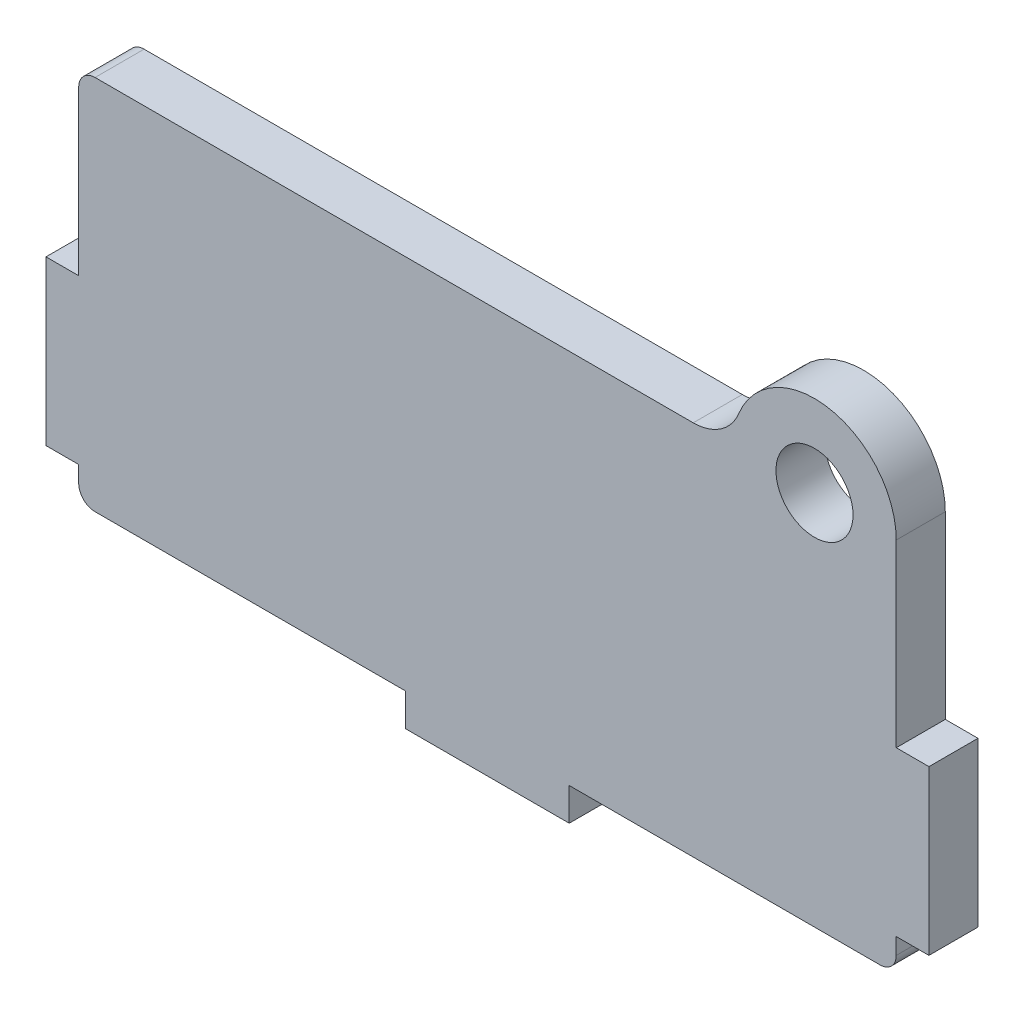
ISO-10303-21;
HEADER;
FILE_DESCRIPTION(('STEP AP214'),'2;1');
FILE_NAME('part.step','',(''),(''),'','','');
FILE_SCHEMA(('AUTOMOTIVE_DESIGN { 1 0 10303 214 1 1 1 1 }'));
ENDSEC;
DATA;
#1=APPLICATION_CONTEXT('core data for automotive mechanical design processes');
#2=APPLICATION_PROTOCOL_DEFINITION('international standard','automotive_design',2000,#1);
#3=PRODUCT_CONTEXT('',#1,'mechanical');
#4=PRODUCT('Part','Part','',(#3));
#5=PRODUCT_RELATED_PRODUCT_CATEGORY('part','',(#4));
#6=PRODUCT_DEFINITION_FORMATION('','',#4);
#7=PRODUCT_DEFINITION_CONTEXT('part definition',#1,'design');
#8=PRODUCT_DEFINITION('design','',#6,#7);
#9=PRODUCT_DEFINITION_SHAPE('','',#8);
#10=(LENGTH_UNIT() NAMED_UNIT(*) SI_UNIT(.MILLI.,.METRE.));
#11=(NAMED_UNIT(*) PLANE_ANGLE_UNIT() SI_UNIT($,.RADIAN.));
#12=(NAMED_UNIT(*) SI_UNIT($,.STERADIAN.) SOLID_ANGLE_UNIT());
#13=UNCERTAINTY_MEASURE_WITH_UNIT(LENGTH_MEASURE(1.E-05),#10,'distance_accuracy_value','');
#14=(GEOMETRIC_REPRESENTATION_CONTEXT(3) GLOBAL_UNCERTAINTY_ASSIGNED_CONTEXT((#13)) GLOBAL_UNIT_ASSIGNED_CONTEXT((#10,
#11,#12)) REPRESENTATION_CONTEXT('',''));
#15=CARTESIAN_POINT('',(0.,0.,0.));
#16=DIRECTION('',(0.,0.,1.));
#17=DIRECTION('',(1.,0.,0.));
#18=AXIS2_PLACEMENT_3D('',#15,#16,#17);
#19=CARTESIAN_POINT('',(1.968250817545,-0.726030375835,3.));
#20=DIRECTION('',(0.,0.,1.));
#21=DIRECTION('',(1.,0.,0.));
#22=AXIS2_PLACEMENT_3D('',#19,#20,#21);
#23=PLANE('',#22);
#24=CARTESIAN_POINT('',(20.,10.,3.));
#25=DIRECTION('',(0.,0.,1.));
#26=DIRECTION('',(1.,0.,0.));
#27=AXIS2_PLACEMENT_3D('',#24,#25,#26);
#28=CIRCLE('',#27,2.35683);
#29=CARTESIAN_POINT('',(22.35683,10.,3.));
#30=VERTEX_POINT('',#29);
#31=EDGE_CURVE('E9',#30,#30,#28,.T.);
#32=ORIENTED_EDGE('',*,*,#31,.F.);
#33=EDGE_LOOP('',(#32));
#34=FACE_BOUND('',#33,.T.);
#35=DIRECTION('',(-1.,0.,0.));
#36=VECTOR('',#35,1.);
#37=CARTESIAN_POINT('',(15.,10.,3.));
#38=LINE('',#37,#36);
#39=CARTESIAN_POINT('',(12.583801434011,10.,3.));
#40=VERTEX_POINT('',#39);
#41=CARTESIAN_POINT('',(-24.,10.,3.));
#42=VERTEX_POINT('',#41);
#43=EDGE_CURVE('E180',#40,#42,#38,.T.);
#44=ORIENTED_EDGE('',*,*,#43,.T.);
#45=CARTESIAN_POINT('',(-24.,9.,3.));
#46=DIRECTION('',(0.,0.,1.));
#47=DIRECTION('',(0.,-1.,0.));
#48=AXIS2_PLACEMENT_3D('',#45,#46,#47);
#49=CIRCLE('',#48,1.);
#50=CARTESIAN_POINT('',(-25.,9.,3.));
#51=VERTEX_POINT('',#50);
#52=EDGE_CURVE('E239',#42,#51,#49,.T.);
#53=ORIENTED_EDGE('',*,*,#52,.T.);
#54=DIRECTION('',(0.,-1.,0.));
#55=VECTOR('',#54,1.);
#56=CARTESIAN_POINT('',(-25.,10.,3.));
#57=LINE('',#56,#55);
#58=CARTESIAN_POINT('',(-25.,-1.,3.));
#59=VERTEX_POINT('',#58);
#60=EDGE_CURVE('E18',#51,#59,#57,.T.);
#61=ORIENTED_EDGE('',*,*,#60,.T.);
#62=DIRECTION('',(-1.,0.,0.));
#63=VECTOR('',#62,1.);
#64=CARTESIAN_POINT('',(-25.,-1.,3.));
#65=LINE('',#64,#63);
#66=CARTESIAN_POINT('',(-27.,-1.,3.));
#67=VERTEX_POINT('',#66);
#68=EDGE_CURVE('E189',#59,#67,#65,.T.);
#69=ORIENTED_EDGE('',*,*,#68,.T.);
#70=DIRECTION('',(0.,-1.,0.));
#71=VECTOR('',#70,1.);
#72=CARTESIAN_POINT('',(-27.,-1.,3.));
#73=LINE('',#72,#71);
#74=CARTESIAN_POINT('',(-27.,-11.,3.));
#75=VERTEX_POINT('',#74);
#76=EDGE_CURVE('E338',#67,#75,#73,.T.);
#77=ORIENTED_EDGE('',*,*,#76,.T.);
#78=DIRECTION('',(1.,0.,0.));
#79=VECTOR('',#78,1.);
#80=CARTESIAN_POINT('',(-27.,-11.,3.));
#81=LINE('',#80,#79);
#82=CARTESIAN_POINT('',(-25.,-11.,3.));
#83=VERTEX_POINT('',#82);
#84=EDGE_CURVE('E292',#75,#83,#81,.T.);
#85=ORIENTED_EDGE('',*,*,#84,.T.);
#86=DIRECTION('',(0.,-1.,0.));
#87=VECTOR('',#86,1.);
#88=CARTESIAN_POINT('',(-25.,-11.,3.));
#89=LINE('',#88,#87);
#90=CARTESIAN_POINT('',(-25.,-12.,3.));
#91=VERTEX_POINT('',#90);
#92=EDGE_CURVE('E259',#83,#91,#89,.T.);
#93=ORIENTED_EDGE('',*,*,#92,.T.);
#94=CARTESIAN_POINT('',(-24.,-12.,3.));
#95=DIRECTION('',(0.,0.,1.));
#96=DIRECTION('',(0.,-1.,0.));
#97=AXIS2_PLACEMENT_3D('',#94,#95,#96);
#98=CIRCLE('',#97,1.);
#99=CARTESIAN_POINT('',(-24.,-13.,3.));
#100=VERTEX_POINT('',#99);
#101=EDGE_CURVE('E267',#91,#100,#98,.T.);
#102=ORIENTED_EDGE('',*,*,#101,.T.);
#103=DIRECTION('',(1.,0.,0.));
#104=VECTOR('',#103,1.);
#105=CARTESIAN_POINT('',(-25.,-13.,3.));
#106=LINE('',#105,#104);
#107=CARTESIAN_POINT('',(-5.,-13.,3.));
#108=VERTEX_POINT('',#107);
#109=EDGE_CURVE('E221',#100,#108,#106,.T.);
#110=ORIENTED_EDGE('',*,*,#109,.T.);
#111=DIRECTION('',(0.,-1.,0.));
#112=VECTOR('',#111,1.);
#113=CARTESIAN_POINT('',(-5.,-13.,3.));
#114=LINE('',#113,#112);
#115=CARTESIAN_POINT('',(-5.,-15.,3.));
#116=VERTEX_POINT('',#115);
#117=EDGE_CURVE('E195',#108,#116,#114,.T.);
#118=ORIENTED_EDGE('',*,*,#117,.T.);
#119=DIRECTION('',(1.,0.,0.));
#120=VECTOR('',#119,1.);
#121=CARTESIAN_POINT('',(-5.,-15.,3.));
#122=LINE('',#121,#120);
#123=CARTESIAN_POINT('',(5.,-15.,3.));
#124=VERTEX_POINT('',#123);
#125=EDGE_CURVE('E227',#116,#124,#122,.T.);
#126=ORIENTED_EDGE('',*,*,#125,.T.);
#127=DIRECTION('',(0.,-1.,0.));
#128=VECTOR('',#127,1.);
#129=CARTESIAN_POINT('',(5.,-13.,3.));
#130=LINE('',#129,#128);
#131=CARTESIAN_POINT('',(5.,-13.,3.));
#132=VERTEX_POINT('',#131);
#133=EDGE_CURVE('E165',#132,#124,#130,.T.);
#134=ORIENTED_EDGE('',*,*,#133,.F.);
#135=DIRECTION('',(-1.,0.,0.));
#136=VECTOR('',#135,1.);
#137=CARTESIAN_POINT('',(25.,-13.,3.));
#138=LINE('',#137,#136);
#139=CARTESIAN_POINT('',(24.,-13.,3.));
#140=VERTEX_POINT('',#139);
#141=EDGE_CURVE('E199',#140,#132,#138,.T.);
#142=ORIENTED_EDGE('',*,*,#141,.F.);
#143=CARTESIAN_POINT('',(24.,-12.,3.));
#144=DIRECTION('',(0.,0.,-1.));
#145=DIRECTION('',(0.,-1.,0.));
#146=AXIS2_PLACEMENT_3D('',#143,#144,#145);
#147=CIRCLE('',#146,1.);
#148=CARTESIAN_POINT('',(25.,-12.,3.));
#149=VERTEX_POINT('',#148);
#150=EDGE_CURVE('E217',#149,#140,#147,.T.);
#151=ORIENTED_EDGE('',*,*,#150,.F.);
#152=DIRECTION('',(0.,-1.,0.));
#153=VECTOR('',#152,1.);
#154=CARTESIAN_POINT('',(25.,-11.,3.));
#155=LINE('',#154,#153);
#156=CARTESIAN_POINT('',(25.,-11.,3.));
#157=VERTEX_POINT('',#156);
#158=EDGE_CURVE('E271',#157,#149,#155,.T.);
#159=ORIENTED_EDGE('',*,*,#158,.F.);
#160=DIRECTION('',(1.,0.,0.));
#161=VECTOR('',#160,1.);
#162=CARTESIAN_POINT('',(25.,-11.,3.));
#163=LINE('',#162,#161);
#164=CARTESIAN_POINT('',(27.,-11.,3.));
#165=VERTEX_POINT('',#164);
#166=EDGE_CURVE('E266',#157,#165,#163,.T.);
#167=ORIENTED_EDGE('',*,*,#166,.T.);
#168=DIRECTION('',(0.,-1.,0.));
#169=VECTOR('',#168,1.);
#170=CARTESIAN_POINT('',(27.,-1.,3.));
#171=LINE('',#170,#169);
#172=CARTESIAN_POINT('',(27.,-1.,3.));
#173=VERTEX_POINT('',#172);
#174=EDGE_CURVE('E288',#173,#165,#171,.T.);
#175=ORIENTED_EDGE('',*,*,#174,.F.);
#176=DIRECTION('',(1.,0.,0.));
#177=VECTOR('',#176,1.);
#178=CARTESIAN_POINT('',(25.,-1.,3.));
#179=LINE('',#178,#177);
#180=CARTESIAN_POINT('',(25.,-1.,3.));
#181=VERTEX_POINT('',#180);
#182=EDGE_CURVE('E341',#181,#173,#179,.T.);
#183=ORIENTED_EDGE('',*,*,#182,.F.);
#184=DIRECTION('',(0.,-1.,0.));
#185=VECTOR('',#184,1.);
#186=CARTESIAN_POINT('',(25.,10.,3.));
#187=LINE('',#186,#185);
#188=CARTESIAN_POINT('',(25.,10.,3.));
#189=VERTEX_POINT('',#188);
#190=EDGE_CURVE('E193',#189,#181,#187,.T.);
#191=ORIENTED_EDGE('',*,*,#190,.F.);
#192=CARTESIAN_POINT('',(20.,10.00000019503,3.));
#193=DIRECTION('',(0.,0.,1.));
#194=DIRECTION('',(1.,0.,0.));
#195=AXIS2_PLACEMENT_3D('',#192,#193,#194);
#196=CIRCLE('',#195,5.);
#197=CARTESIAN_POINT('',(15.364875896257,11.875000073136,3.));
#198=VERTEX_POINT('',#197);
#199=EDGE_CURVE('E293',#189,#198,#196,.T.);
#200=ORIENTED_EDGE('',*,*,#199,.T.);
#201=CARTESIAN_POINT('',(12.583801434011,13.,3.));
#202=DIRECTION('',(0.,0.,-1.));
#203=DIRECTION('',(0.,-1.,0.));
#204=AXIS2_PLACEMENT_3D('',#201,#202,#203);
#205=CIRCLE('',#204,3.);
#206=EDGE_CURVE('E235',#198,#40,#205,.T.);
#207=ORIENTED_EDGE('',*,*,#206,.T.);
#208=EDGE_LOOP('',(#44,#53,#61,#69,#77,#85,#93,#102,#110,#118,#126,#134,#142,#151,#159,#167,
#175,#183,#191,#200,#207));
#209=FACE_BOUND('',#208,.T.);
#210=ADVANCED_FACE('F14',(#34,#209),#23,.T.);
#211=CARTESIAN_POINT('',(20.,10.,0.));
#212=DIRECTION('',(0.,0.,-1.));
#213=DIRECTION('',(1.,0.,0.));
#214=AXIS2_PLACEMENT_3D('',#211,#212,#213);
#215=CYLINDRICAL_SURFACE('',#214,2.35683);
#216=DIRECTION('',(0.,0.,1.));
#217=VECTOR('',#216,1.);
#218=CARTESIAN_POINT('',(22.35683,10.,0.));
#219=LINE('',#218,#217);
#220=CARTESIAN_POINT('',(22.35683,10.,0.));
#221=VERTEX_POINT('',#220);
#222=EDGE_CURVE('E25',#221,#30,#219,.T.);
#223=ORIENTED_EDGE('',*,*,#222,.T.);
#224=ORIENTED_EDGE('',*,*,#31,.T.);
#225=ORIENTED_EDGE('',*,*,#222,.F.);
#226=CARTESIAN_POINT('',(20.,10.,0.));
#227=DIRECTION('',(0.,0.,1.));
#228=DIRECTION('',(1.,0.,0.));
#229=AXIS2_PLACEMENT_3D('',#226,#227,#228);
#230=CIRCLE('',#229,2.35683);
#231=EDGE_CURVE('E163',#221,#221,#230,.T.);
#232=ORIENTED_EDGE('',*,*,#231,.F.);
#233=EDGE_LOOP('',(#223,#224,#225,#232));
#234=FACE_BOUND('',#233,.T.);
#235=ADVANCED_FACE('F162',(#234),#215,.F.);
#236=CARTESIAN_POINT('',(5.,-13.,0.));
#237=DIRECTION('',(1.,0.,0.));
#238=DIRECTION('',(0.,1.,0.));
#239=AXIS2_PLACEMENT_3D('',#236,#237,#238);
#240=PLANE('',#239);
#241=DIRECTION('',(0.,0.,1.));
#242=VECTOR('',#241,1.);
#243=CARTESIAN_POINT('',(5.,-13.,0.));
#244=LINE('',#243,#242);
#245=CARTESIAN_POINT('',(5.,-13.,0.));
#246=VERTEX_POINT('',#245);
#247=EDGE_CURVE('E228',#246,#132,#244,.T.);
#248=ORIENTED_EDGE('',*,*,#247,.T.);
#249=ORIENTED_EDGE('',*,*,#133,.T.);
#250=DIRECTION('',(0.,0.,1.));
#251=VECTOR('',#250,1.);
#252=CARTESIAN_POINT('',(5.,-15.,0.));
#253=LINE('',#252,#251);
#254=CARTESIAN_POINT('',(5.,-15.,0.));
#255=VERTEX_POINT('',#254);
#256=EDGE_CURVE('E223',#255,#124,#253,.T.);
#257=ORIENTED_EDGE('',*,*,#256,.F.);
#258=DIRECTION('',(0.,-1.,0.));
#259=VECTOR('',#258,1.);
#260=CARTESIAN_POINT('',(5.,-13.,0.));
#261=LINE('',#260,#259);
#262=EDGE_CURVE('E207',#246,#255,#261,.T.);
#263=ORIENTED_EDGE('',*,*,#262,.F.);
#264=EDGE_LOOP('',(#248,#249,#257,#263));
#265=FACE_BOUND('',#264,.T.);
#266=ADVANCED_FACE('F702',(#265),#240,.T.);
#267=CARTESIAN_POINT('',(-5.,-15.,0.));
#268=DIRECTION('',(0.,1.,0.));
#269=DIRECTION('',(1.,0.,0.));
#270=AXIS2_PLACEMENT_3D('',#267,#268,#269);
#271=PLANE('',#270);
#272=DIRECTION('',(1.,0.,0.));
#273=VECTOR('',#272,1.);
#274=CARTESIAN_POINT('',(-5.,-15.,0.));
#275=LINE('',#274,#273);
#276=CARTESIAN_POINT('',(-5.,-15.,0.));
#277=VERTEX_POINT('',#276);
#278=EDGE_CURVE('E206',#277,#255,#275,.T.);
#279=ORIENTED_EDGE('',*,*,#278,.T.);
#280=ORIENTED_EDGE('',*,*,#256,.T.);
#281=ORIENTED_EDGE('',*,*,#125,.F.);
#282=DIRECTION('',(0.,0.,1.));
#283=VECTOR('',#282,1.);
#284=CARTESIAN_POINT('',(-5.,-15.,0.));
#285=LINE('',#284,#283);
#286=EDGE_CURVE('E200',#277,#116,#285,.T.);
#287=ORIENTED_EDGE('',*,*,#286,.F.);
#288=EDGE_LOOP('',(#279,#280,#281,#287));
#289=FACE_BOUND('',#288,.T.);
#290=ADVANCED_FACE('F517',(#289),#271,.F.);
#291=CARTESIAN_POINT('',(25.,-13.,0.));
#292=DIRECTION('',(0.,-1.,0.));
#293=DIRECTION('',(0.,0.,-1.));
#294=AXIS2_PLACEMENT_3D('',#291,#292,#293);
#295=PLANE('',#294);
#296=DIRECTION('',(-1.,0.,0.));
#297=VECTOR('',#296,1.);
#298=CARTESIAN_POINT('',(25.,-13.,0.));
#299=LINE('',#298,#297);
#300=CARTESIAN_POINT('',(24.,-13.,0.));
#301=VERTEX_POINT('',#300);
#302=EDGE_CURVE('E211',#301,#246,#299,.T.);
#303=ORIENTED_EDGE('',*,*,#302,.F.);
#304=DIRECTION('',(0.,0.,1.));
#305=VECTOR('',#304,1.);
#306=CARTESIAN_POINT('',(24.,-13.,0.));
#307=LINE('',#306,#305);
#308=EDGE_CURVE('E220',#301,#140,#307,.T.);
#309=ORIENTED_EDGE('',*,*,#308,.T.);
#310=ORIENTED_EDGE('',*,*,#141,.T.);
#311=ORIENTED_EDGE('',*,*,#247,.F.);
#312=EDGE_LOOP('',(#303,#309,#310,#311));
#313=FACE_BOUND('',#312,.T.);
#314=ADVANCED_FACE('F492',(#313),#295,.T.);
#315=CARTESIAN_POINT('',(-5.,-13.,0.));
#316=DIRECTION('',(1.,0.,0.));
#317=DIRECTION('',(0.,1.,0.));
#318=AXIS2_PLACEMENT_3D('',#315,#316,#317);
#319=PLANE('',#318);
#320=DIRECTION('',(0.,-1.,0.));
#321=VECTOR('',#320,1.);
#322=CARTESIAN_POINT('',(-5.,-13.,0.));
#323=LINE('',#322,#321);
#324=CARTESIAN_POINT('',(-5.,-13.,0.));
#325=VERTEX_POINT('',#324);
#326=EDGE_CURVE('E201',#325,#277,#323,.T.);
#327=ORIENTED_EDGE('',*,*,#326,.T.);
#328=ORIENTED_EDGE('',*,*,#286,.T.);
#329=ORIENTED_EDGE('',*,*,#117,.F.);
#330=DIRECTION('',(0.,0.,1.));
#331=VECTOR('',#330,1.);
#332=CARTESIAN_POINT('',(-5.,-13.,0.));
#333=LINE('',#332,#331);
#334=EDGE_CURVE('E187',#325,#108,#333,.T.);
#335=ORIENTED_EDGE('',*,*,#334,.F.);
#336=EDGE_LOOP('',(#327,#328,#329,#335));
#337=FACE_BOUND('',#336,.T.);
#338=ADVANCED_FACE('F516',(#337),#319,.F.);
#339=CARTESIAN_POINT('',(24.,-12.,0.));
#340=DIRECTION('',(0.,0.,1.));
#341=DIRECTION('',(1.,0.,0.));
#342=AXIS2_PLACEMENT_3D('',#339,#340,#341);
#343=CYLINDRICAL_SURFACE('',#342,1.);
#344=DIRECTION('',(0.,0.,1.));
#345=VECTOR('',#344,1.);
#346=CARTESIAN_POINT('',(25.,-12.,0.));
#347=LINE('',#346,#345);
#348=CARTESIAN_POINT('',(25.,-12.,0.));
#349=VERTEX_POINT('',#348);
#350=EDGE_CURVE('E317',#349,#149,#347,.T.);
#351=ORIENTED_EDGE('',*,*,#350,.T.);
#352=ORIENTED_EDGE('',*,*,#150,.T.);
#353=ORIENTED_EDGE('',*,*,#308,.F.);
#354=CARTESIAN_POINT('',(24.,-12.,0.));
#355=DIRECTION('',(0.,0.,-1.));
#356=DIRECTION('',(0.,-1.,0.));
#357=AXIS2_PLACEMENT_3D('',#354,#355,#356);
#358=CIRCLE('',#357,1.);
#359=EDGE_CURVE('E249',#349,#301,#358,.T.);
#360=ORIENTED_EDGE('',*,*,#359,.F.);
#361=EDGE_LOOP('',(#351,#352,#353,#360));
#362=FACE_BOUND('',#361,.T.);
#363=ADVANCED_FACE('F483',(#362),#343,.T.);
#364=CARTESIAN_POINT('',(-25.,-13.,0.));
#365=DIRECTION('',(0.,1.,0.));
#366=DIRECTION('',(1.,0.,0.));
#367=AXIS2_PLACEMENT_3D('',#364,#365,#366);
#368=PLANE('',#367);
#369=ORIENTED_EDGE('',*,*,#334,.T.);
#370=ORIENTED_EDGE('',*,*,#109,.F.);
#371=DIRECTION('',(0.,0.,1.));
#372=VECTOR('',#371,1.);
#373=CARTESIAN_POINT('',(-24.,-13.,0.));
#374=LINE('',#373,#372);
#375=CARTESIAN_POINT('',(-24.,-13.,0.));
#376=VERTEX_POINT('',#375);
#377=EDGE_CURVE('E265',#376,#100,#374,.T.);
#378=ORIENTED_EDGE('',*,*,#377,.F.);
#379=DIRECTION('',(1.,0.,0.));
#380=VECTOR('',#379,1.);
#381=CARTESIAN_POINT('',(-25.,-13.,0.));
#382=LINE('',#381,#380);
#383=EDGE_CURVE('E205',#376,#325,#382,.T.);
#384=ORIENTED_EDGE('',*,*,#383,.T.);
#385=EDGE_LOOP('',(#369,#370,#378,#384));
#386=FACE_BOUND('',#385,.T.);
#387=ADVANCED_FACE('F16',(#386),#368,.F.);
#388=CARTESIAN_POINT('',(25.,-11.,0.));
#389=DIRECTION('',(1.,0.,0.));
#390=DIRECTION('',(0.,1.,0.));
#391=AXIS2_PLACEMENT_3D('',#388,#389,#390);
#392=PLANE('',#391);
#393=DIRECTION('',(0.,-1.,0.));
#394=VECTOR('',#393,1.);
#395=CARTESIAN_POINT('',(25.,-11.,0.));
#396=LINE('',#395,#394);
#397=CARTESIAN_POINT('',(25.,-11.,0.));
#398=VERTEX_POINT('',#397);
#399=EDGE_CURVE('E245',#398,#349,#396,.T.);
#400=ORIENTED_EDGE('',*,*,#399,.F.);
#401=DIRECTION('',(0.,0.,1.));
#402=VECTOR('',#401,1.);
#403=CARTESIAN_POINT('',(25.,-11.,0.));
#404=LINE('',#403,#402);
#405=EDGE_CURVE('E261',#398,#157,#404,.T.);
#406=ORIENTED_EDGE('',*,*,#405,.T.);
#407=ORIENTED_EDGE('',*,*,#158,.T.);
#408=ORIENTED_EDGE('',*,*,#350,.F.);
#409=EDGE_LOOP('',(#400,#406,#407,#408));
#410=FACE_BOUND('',#409,.T.);
#411=ADVANCED_FACE('F480',(#410),#392,.T.);
#412=CARTESIAN_POINT('',(-24.,-12.,0.));
#413=DIRECTION('',(0.,0.,1.));
#414=DIRECTION('',(-1.,0.,0.));
#415=AXIS2_PLACEMENT_3D('',#412,#413,#414);
#416=CYLINDRICAL_SURFACE('',#415,1.);
#417=CARTESIAN_POINT('',(-24.,-12.,0.));
#418=DIRECTION('',(0.,0.,1.));
#419=DIRECTION('',(0.,-1.,0.));
#420=AXIS2_PLACEMENT_3D('',#417,#418,#419);
#421=CIRCLE('',#420,1.);
#422=CARTESIAN_POINT('',(-25.,-12.,0.));
#423=VERTEX_POINT('',#422);
#424=EDGE_CURVE('E212',#423,#376,#421,.T.);
#425=ORIENTED_EDGE('',*,*,#424,.T.);
#426=ORIENTED_EDGE('',*,*,#377,.T.);
#427=ORIENTED_EDGE('',*,*,#101,.F.);
#428=DIRECTION('',(0.,0.,1.));
#429=VECTOR('',#428,1.);
#430=CARTESIAN_POINT('',(-25.,-12.,0.));
#431=LINE('',#430,#429);
#432=EDGE_CURVE('E255',#423,#91,#431,.T.);
#433=ORIENTED_EDGE('',*,*,#432,.F.);
#434=EDGE_LOOP('',(#425,#426,#427,#433));
#435=FACE_BOUND('',#434,.T.);
#436=ADVANCED_FACE('F511',(#435),#416,.T.);
#437=CARTESIAN_POINT('',(25.,-11.,0.));
#438=DIRECTION('',(0.,1.,0.));
#439=DIRECTION('',(1.,0.,0.));
#440=AXIS2_PLACEMENT_3D('',#437,#438,#439);
#441=PLANE('',#440);
#442=DIRECTION('',(1.,0.,0.));
#443=VECTOR('',#442,1.);
#444=CARTESIAN_POINT('',(25.,-11.,0.));
#445=LINE('',#444,#443);
#446=CARTESIAN_POINT('',(27.,-11.,0.));
#447=VERTEX_POINT('',#446);
#448=EDGE_CURVE('E250',#398,#447,#445,.T.);
#449=ORIENTED_EDGE('',*,*,#448,.T.);
#450=DIRECTION('',(0.,0.,1.));
#451=VECTOR('',#450,1.);
#452=CARTESIAN_POINT('',(27.,-11.,0.));
#453=LINE('',#452,#451);
#454=EDGE_CURVE('E260',#447,#165,#453,.T.);
#455=ORIENTED_EDGE('',*,*,#454,.T.);
#456=ORIENTED_EDGE('',*,*,#166,.F.);
#457=ORIENTED_EDGE('',*,*,#405,.F.);
#458=EDGE_LOOP('',(#449,#455,#456,#457));
#459=FACE_BOUND('',#458,.T.);
#460=ADVANCED_FACE('F488',(#459),#441,.F.);
#461=CARTESIAN_POINT('',(-25.,-11.,0.));
#462=DIRECTION('',(1.,0.,0.));
#463=DIRECTION('',(0.,1.,0.));
#464=AXIS2_PLACEMENT_3D('',#461,#462,#463);
#465=PLANE('',#464);
#466=ORIENTED_EDGE('',*,*,#432,.T.);
#467=ORIENTED_EDGE('',*,*,#92,.F.);
#468=DIRECTION('',(0.,0.,1.));
#469=VECTOR('',#468,1.);
#470=CARTESIAN_POINT('',(-25.,-11.,0.));
#471=LINE('',#470,#469);
#472=CARTESIAN_POINT('',(-25.,-11.,0.));
#473=VERTEX_POINT('',#472);
#474=EDGE_CURVE('E362',#473,#83,#471,.T.);
#475=ORIENTED_EDGE('',*,*,#474,.F.);
#476=DIRECTION('',(0.,-1.,0.));
#477=VECTOR('',#476,1.);
#478=CARTESIAN_POINT('',(-25.,-11.,0.));
#479=LINE('',#478,#477);
#480=EDGE_CURVE('E216',#473,#423,#479,.T.);
#481=ORIENTED_EDGE('',*,*,#480,.T.);
#482=EDGE_LOOP('',(#466,#467,#475,#481));
#483=FACE_BOUND('',#482,.T.);
#484=ADVANCED_FACE('F501',(#483),#465,.F.);
#485=CARTESIAN_POINT('',(27.,-1.,0.));
#486=DIRECTION('',(1.,0.,0.));
#487=DIRECTION('',(0.,1.,0.));
#488=AXIS2_PLACEMENT_3D('',#485,#486,#487);
#489=PLANE('',#488);
#490=DIRECTION('',(0.,0.,1.));
#491=VECTOR('',#490,1.);
#492=CARTESIAN_POINT('',(27.,-1.,0.));
#493=LINE('',#492,#491);
#494=CARTESIAN_POINT('',(27.,-1.,0.));
#495=VERTEX_POINT('',#494);
#496=EDGE_CURVE('E350',#495,#173,#493,.T.);
#497=ORIENTED_EDGE('',*,*,#496,.T.);
#498=ORIENTED_EDGE('',*,*,#174,.T.);
#499=ORIENTED_EDGE('',*,*,#454,.F.);
#500=DIRECTION('',(0.,-1.,0.));
#501=VECTOR('',#500,1.);
#502=CARTESIAN_POINT('',(27.,-1.,0.));
#503=LINE('',#502,#501);
#504=EDGE_CURVE('E307',#495,#447,#503,.T.);
#505=ORIENTED_EDGE('',*,*,#504,.F.);
#506=EDGE_LOOP('',(#497,#498,#499,#505));
#507=FACE_BOUND('',#506,.T.);
#508=ADVANCED_FACE('F691',(#507),#489,.T.);
#509=CARTESIAN_POINT('',(-27.,-11.,0.));
#510=DIRECTION('',(0.,1.,0.));
#511=DIRECTION('',(1.,0.,0.));
#512=AXIS2_PLACEMENT_3D('',#509,#510,#511);
#513=PLANE('',#512);
#514=DIRECTION('',(1.,0.,0.));
#515=VECTOR('',#514,1.);
#516=CARTESIAN_POINT('',(-27.,-11.,0.));
#517=LINE('',#516,#515);
#518=CARTESIAN_POINT('',(-27.,-11.,0.));
#519=VERTEX_POINT('',#518);
#520=EDGE_CURVE('E275',#519,#473,#517,.T.);
#521=ORIENTED_EDGE('',*,*,#520,.T.);
#522=ORIENTED_EDGE('',*,*,#474,.T.);
#523=ORIENTED_EDGE('',*,*,#84,.F.);
#524=DIRECTION('',(0.,0.,1.));
#525=VECTOR('',#524,1.);
#526=CARTESIAN_POINT('',(-27.,-11.,0.));
#527=LINE('',#526,#525);
#528=EDGE_CURVE('E302',#519,#75,#527,.T.);
#529=ORIENTED_EDGE('',*,*,#528,.F.);
#530=EDGE_LOOP('',(#521,#522,#523,#529));
#531=FACE_BOUND('',#530,.T.);
#532=ADVANCED_FACE('F504',(#531),#513,.F.);
#533=CARTESIAN_POINT('',(25.,-1.,0.));
#534=DIRECTION('',(0.,1.,0.));
#535=DIRECTION('',(1.,0.,0.));
#536=AXIS2_PLACEMENT_3D('',#533,#534,#535);
#537=PLANE('',#536);
#538=DIRECTION('',(0.,0.,1.));
#539=VECTOR('',#538,1.);
#540=CARTESIAN_POINT('',(25.,-1.,0.));
#541=LINE('',#540,#539);
#542=CARTESIAN_POINT('',(25.,-1.,0.));
#543=VERTEX_POINT('',#542);
#544=EDGE_CURVE('E298',#543,#181,#541,.T.);
#545=ORIENTED_EDGE('',*,*,#544,.T.);
#546=ORIENTED_EDGE('',*,*,#182,.T.);
#547=ORIENTED_EDGE('',*,*,#496,.F.);
#548=DIRECTION('',(1.,0.,0.));
#549=VECTOR('',#548,1.);
#550=CARTESIAN_POINT('',(25.,-1.,0.));
#551=LINE('',#550,#549);
#552=EDGE_CURVE('E280',#543,#495,#551,.T.);
#553=ORIENTED_EDGE('',*,*,#552,.F.);
#554=EDGE_LOOP('',(#545,#546,#547,#553));
#555=FACE_BOUND('',#554,.T.);
#556=ADVANCED_FACE('F710',(#555),#537,.T.);
#557=CARTESIAN_POINT('',(-27.,-1.,0.));
#558=DIRECTION('',(1.,0.,0.));
#559=DIRECTION('',(0.,1.,0.));
#560=AXIS2_PLACEMENT_3D('',#557,#558,#559);
#561=PLANE('',#560);
#562=DIRECTION('',(0.,-1.,0.));
#563=VECTOR('',#562,1.);
#564=CARTESIAN_POINT('',(-27.,-1.,0.));
#565=LINE('',#564,#563);
#566=CARTESIAN_POINT('',(-27.,-1.,0.));
#567=VERTEX_POINT('',#566);
#568=EDGE_CURVE('E234',#567,#519,#565,.T.);
#569=ORIENTED_EDGE('',*,*,#568,.T.);
#570=ORIENTED_EDGE('',*,*,#528,.T.);
#571=ORIENTED_EDGE('',*,*,#76,.F.);
#572=DIRECTION('',(0.,0.,1.));
#573=VECTOR('',#572,1.);
#574=CARTESIAN_POINT('',(-27.,-1.,0.));
#575=LINE('',#574,#573);
#576=EDGE_CURVE('E194',#567,#67,#575,.T.);
#577=ORIENTED_EDGE('',*,*,#576,.F.);
#578=EDGE_LOOP('',(#569,#570,#571,#577));
#579=FACE_BOUND('',#578,.T.);
#580=ADVANCED_FACE('F727',(#579),#561,.F.);
#581=CARTESIAN_POINT('',(25.,10.,0.));
#582=DIRECTION('',(1.,0.,0.));
#583=DIRECTION('',(0.,1.,0.));
#584=AXIS2_PLACEMENT_3D('',#581,#582,#583);
#585=PLANE('',#584);
#586=DIRECTION('',(0.,0.,1.));
#587=VECTOR('',#586,1.);
#588=CARTESIAN_POINT('',(25.,10.,0.));
#589=LINE('',#588,#587);
#590=CARTESIAN_POINT('',(25.,10.,0.));
#591=VERTEX_POINT('',#590);
#592=EDGE_CURVE('E297',#591,#189,#589,.T.);
#593=ORIENTED_EDGE('',*,*,#592,.T.);
#594=ORIENTED_EDGE('',*,*,#190,.T.);
#595=ORIENTED_EDGE('',*,*,#544,.F.);
#596=DIRECTION('',(0.,-1.,0.));
#597=VECTOR('',#596,1.);
#598=CARTESIAN_POINT('',(25.,10.,0.));
#599=LINE('',#598,#597);
#600=EDGE_CURVE('E276',#591,#543,#599,.T.);
#601=ORIENTED_EDGE('',*,*,#600,.F.);
#602=EDGE_LOOP('',(#593,#594,#595,#601));
#603=FACE_BOUND('',#602,.T.);
#604=ADVANCED_FACE('F806',(#603),#585,.T.);
#605=CARTESIAN_POINT('',(-25.,-1.,0.));
#606=DIRECTION('',(0.,-1.,0.));
#607=DIRECTION('',(0.,0.,-1.));
#608=AXIS2_PLACEMENT_3D('',#605,#606,#607);
#609=PLANE('',#608);
#610=DIRECTION('',(-1.,0.,0.));
#611=VECTOR('',#610,1.);
#612=CARTESIAN_POINT('',(-25.,-1.,0.));
#613=LINE('',#612,#611);
#614=CARTESIAN_POINT('',(-25.,-1.,0.));
#615=VERTEX_POINT('',#614);
#616=EDGE_CURVE('E229',#615,#567,#613,.T.);
#617=ORIENTED_EDGE('',*,*,#616,.T.);
#618=ORIENTED_EDGE('',*,*,#576,.T.);
#619=ORIENTED_EDGE('',*,*,#68,.F.);
#620=DIRECTION('',(0.,0.,1.));
#621=VECTOR('',#620,1.);
#622=CARTESIAN_POINT('',(-25.,-1.,0.));
#623=LINE('',#622,#621);
#624=EDGE_CURVE('E251',#615,#59,#623,.T.);
#625=ORIENTED_EDGE('',*,*,#624,.F.);
#626=EDGE_LOOP('',(#617,#618,#619,#625));
#627=FACE_BOUND('',#626,.T.);
#628=ADVANCED_FACE('F790',(#627),#609,.F.);
#629=CARTESIAN_POINT('',(20.,10.00000019503,0.));
#630=DIRECTION('',(0.,0.,-1.));
#631=DIRECTION('',(1.,0.,0.));
#632=AXIS2_PLACEMENT_3D('',#629,#630,#631);
#633=CYLINDRICAL_SURFACE('',#632,5.);
#634=DIRECTION('',(0.,0.,1.));
#635=VECTOR('',#634,1.);
#636=CARTESIAN_POINT('',(15.364875896257,11.875000073136,0.));
#637=LINE('',#636,#635);
#638=CARTESIAN_POINT('',(15.364875896257,11.875000073136,0.));
#639=VERTEX_POINT('',#638);
#640=EDGE_CURVE('E238',#639,#198,#637,.T.);
#641=ORIENTED_EDGE('',*,*,#640,.T.);
#642=ORIENTED_EDGE('',*,*,#199,.F.);
#643=ORIENTED_EDGE('',*,*,#592,.F.);
#644=CARTESIAN_POINT('',(20.,10.00000019503,0.));
#645=DIRECTION('',(0.,0.,1.));
#646=DIRECTION('',(1.,0.,0.));
#647=AXIS2_PLACEMENT_3D('',#644,#645,#646);
#648=CIRCLE('',#647,5.);
#649=EDGE_CURVE('E281',#591,#639,#648,.T.);
#650=ORIENTED_EDGE('',*,*,#649,.T.);
#651=EDGE_LOOP('',(#641,#642,#643,#650));
#652=FACE_BOUND('',#651,.T.);
#653=ADVANCED_FACE('F786',(#652),#633,.T.);
#654=CARTESIAN_POINT('',(-25.,10.,0.));
#655=DIRECTION('',(1.,0.,0.));
#656=DIRECTION('',(0.,1.,0.));
#657=AXIS2_PLACEMENT_3D('',#654,#655,#656);
#658=PLANE('',#657);
#659=ORIENTED_EDGE('',*,*,#624,.T.);
#660=ORIENTED_EDGE('',*,*,#60,.F.);
#661=DIRECTION('',(0.,0.,1.));
#662=VECTOR('',#661,1.);
#663=CARTESIAN_POINT('',(-25.,9.,0.));
#664=LINE('',#663,#662);
#665=CARTESIAN_POINT('',(-25.,9.,0.));
#666=VERTEX_POINT('',#665);
#667=EDGE_CURVE('E306',#666,#51,#664,.T.);
#668=ORIENTED_EDGE('',*,*,#667,.F.);
#669=DIRECTION('',(0.,-1.,0.));
#670=VECTOR('',#669,1.);
#671=CARTESIAN_POINT('',(-25.,10.,0.));
#672=LINE('',#671,#670);
#673=EDGE_CURVE('E233',#666,#615,#672,.T.);
#674=ORIENTED_EDGE('',*,*,#673,.T.);
#675=EDGE_LOOP('',(#659,#660,#668,#674));
#676=FACE_BOUND('',#675,.T.);
#677=ADVANCED_FACE('F432',(#676),#658,.F.);
#678=CARTESIAN_POINT('',(12.583801434011,13.,0.));
#679=DIRECTION('',(0.,0.,1.));
#680=DIRECTION('',(0.927024820748784,-0.374999975620912,0.));
#681=AXIS2_PLACEMENT_3D('',#678,#679,#680);
#682=CYLINDRICAL_SURFACE('',#681,3.);
#683=CARTESIAN_POINT('',(12.583801434011,13.,0.));
#684=DIRECTION('',(0.,0.,-1.));
#685=DIRECTION('',(0.,-1.,0.));
#686=AXIS2_PLACEMENT_3D('',#683,#684,#685);
#687=CIRCLE('',#686,3.);
#688=CARTESIAN_POINT('',(12.583801434011,10.,0.));
#689=VERTEX_POINT('',#688);
#690=EDGE_CURVE('E369',#639,#689,#687,.T.);
#691=ORIENTED_EDGE('',*,*,#690,.T.);
#692=DIRECTION('',(0.,0.,1.));
#693=VECTOR('',#692,1.);
#694=CARTESIAN_POINT('',(12.583801434011,10.,0.));
#695=LINE('',#694,#693);
#696=EDGE_CURVE('E324',#689,#40,#695,.T.);
#697=ORIENTED_EDGE('',*,*,#696,.T.);
#698=ORIENTED_EDGE('',*,*,#206,.F.);
#699=ORIENTED_EDGE('',*,*,#640,.F.);
#700=EDGE_LOOP('',(#691,#697,#698,#699));
#701=FACE_BOUND('',#700,.T.);
#702=ADVANCED_FACE('F715',(#701),#682,.F.);
#703=CARTESIAN_POINT('',(-24.,9.,0.));
#704=DIRECTION('',(0.,0.,1.));
#705=DIRECTION('',(0.,1.,0.));
#706=AXIS2_PLACEMENT_3D('',#703,#704,#705);
#707=CYLINDRICAL_SURFACE('',#706,1.);
#708=CARTESIAN_POINT('',(-24.,9.,0.));
#709=DIRECTION('',(0.,0.,1.));
#710=DIRECTION('',(0.,-1.,0.));
#711=AXIS2_PLACEMENT_3D('',#708,#709,#710);
#712=CIRCLE('',#711,1.);
#713=CARTESIAN_POINT('',(-24.,10.,0.));
#714=VERTEX_POINT('',#713);
#715=EDGE_CURVE('E183',#714,#666,#712,.T.);
#716=ORIENTED_EDGE('',*,*,#715,.T.);
#717=ORIENTED_EDGE('',*,*,#667,.T.);
#718=ORIENTED_EDGE('',*,*,#52,.F.);
#719=DIRECTION('',(0.,0.,1.));
#720=VECTOR('',#719,1.);
#721=CARTESIAN_POINT('',(-24.,10.,0.));
#722=LINE('',#721,#720);
#723=EDGE_CURVE('E171',#714,#42,#722,.T.);
#724=ORIENTED_EDGE('',*,*,#723,.F.);
#725=EDGE_LOOP('',(#716,#717,#718,#724));
#726=FACE_BOUND('',#725,.T.);
#727=ADVANCED_FACE('F426',(#726),#707,.T.);
#728=CARTESIAN_POINT('',(15.,10.,0.));
#729=DIRECTION('',(0.,-1.,0.));
#730=DIRECTION('',(0.,0.,-1.));
#731=AXIS2_PLACEMENT_3D('',#728,#729,#730);
#732=PLANE('',#731);
#733=ORIENTED_EDGE('',*,*,#723,.T.);
#734=ORIENTED_EDGE('',*,*,#43,.F.);
#735=ORIENTED_EDGE('',*,*,#696,.F.);
#736=DIRECTION('',(-1.,0.,0.));
#737=VECTOR('',#736,1.);
#738=CARTESIAN_POINT('',(15.,10.,0.));
#739=LINE('',#738,#737);
#740=EDGE_CURVE('E172',#689,#714,#739,.T.);
#741=ORIENTED_EDGE('',*,*,#740,.T.);
#742=EDGE_LOOP('',(#733,#734,#735,#741));
#743=FACE_BOUND('',#742,.T.);
#744=ADVANCED_FACE('F741',(#743),#732,.F.);
#745=CARTESIAN_POINT('',(1.968250817545,-0.726030375835,0.));
#746=DIRECTION('',(0.,0.,1.));
#747=DIRECTION('',(1.,0.,0.));
#748=AXIS2_PLACEMENT_3D('',#745,#746,#747);
#749=PLANE('',#748);
#750=ORIENTED_EDGE('',*,*,#231,.T.);
#751=EDGE_LOOP('',(#750));
#752=FACE_BOUND('',#751,.T.);
#753=ORIENTED_EDGE('',*,*,#690,.F.);
#754=ORIENTED_EDGE('',*,*,#649,.F.);
#755=ORIENTED_EDGE('',*,*,#600,.T.);
#756=ORIENTED_EDGE('',*,*,#552,.T.);
#757=ORIENTED_EDGE('',*,*,#504,.T.);
#758=ORIENTED_EDGE('',*,*,#448,.F.);
#759=ORIENTED_EDGE('',*,*,#399,.T.);
#760=ORIENTED_EDGE('',*,*,#359,.T.);
#761=ORIENTED_EDGE('',*,*,#302,.T.);
#762=ORIENTED_EDGE('',*,*,#262,.T.);
#763=ORIENTED_EDGE('',*,*,#278,.F.);
#764=ORIENTED_EDGE('',*,*,#326,.F.);
#765=ORIENTED_EDGE('',*,*,#383,.F.);
#766=ORIENTED_EDGE('',*,*,#424,.F.);
#767=ORIENTED_EDGE('',*,*,#480,.F.);
#768=ORIENTED_EDGE('',*,*,#520,.F.);
#769=ORIENTED_EDGE('',*,*,#568,.F.);
#770=ORIENTED_EDGE('',*,*,#616,.F.);
#771=ORIENTED_EDGE('',*,*,#673,.F.);
#772=ORIENTED_EDGE('',*,*,#715,.F.);
#773=ORIENTED_EDGE('',*,*,#740,.F.);
#774=EDGE_LOOP('',(#753,#754,#755,#756,#757,#758,#759,#760,#761,#762,#763,#764,#765,#766,#767,
#768,#769,#770,#771,#772,#773));
#775=FACE_BOUND('',#774,.T.);
#776=ADVANCED_FACE('F168',(#752,#775),#749,.F.);
#777=CLOSED_SHELL('',(#210,#235,#266,#290,#314,#338,#363,#387,#411,#436,#460,#484,#508,#532,
#556,#580,#604,#628,#653,#677,#702,#727,#744,#776));
#778=MANIFOLD_SOLID_BREP('B1',#777);
#779=ADVANCED_BREP_SHAPE_REPRESENTATION('',(#18,#778),#14);
#780=SHAPE_DEFINITION_REPRESENTATION(#9,#779);
ENDSEC;
END-ISO-10303-21;
